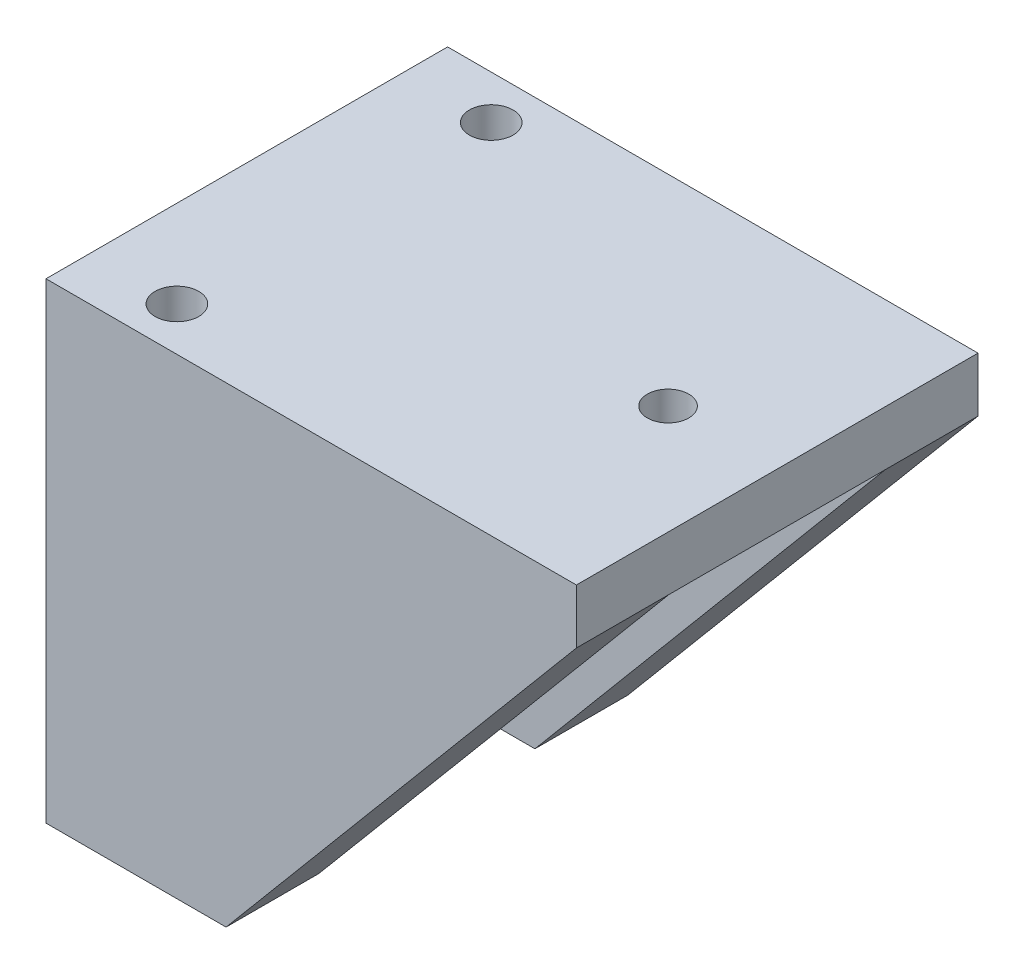
ISO-10303-21;
HEADER;
FILE_DESCRIPTION(('STEP AP214'),'2;1');
FILE_NAME('part.step','',(''),(''),'','','');
FILE_SCHEMA(('AUTOMOTIVE_DESIGN { 1 0 10303 214 1 1 1 1 }'));
ENDSEC;
DATA;
#1=APPLICATION_CONTEXT('core data for automotive mechanical design processes');
#2=APPLICATION_PROTOCOL_DEFINITION('international standard','automotive_design',2000,#1);
#3=PRODUCT_CONTEXT('',#1,'mechanical');
#4=PRODUCT('Part','Part','',(#3));
#5=PRODUCT_RELATED_PRODUCT_CATEGORY('part','',(#4));
#6=PRODUCT_DEFINITION_FORMATION('','',#4);
#7=PRODUCT_DEFINITION_CONTEXT('part definition',#1,'design');
#8=PRODUCT_DEFINITION('design','',#6,#7);
#9=PRODUCT_DEFINITION_SHAPE('','',#8);
#10=(LENGTH_UNIT() NAMED_UNIT(*) SI_UNIT(.MILLI.,.METRE.));
#11=(NAMED_UNIT(*) PLANE_ANGLE_UNIT() SI_UNIT($,.RADIAN.));
#12=(NAMED_UNIT(*) SI_UNIT($,.STERADIAN.) SOLID_ANGLE_UNIT());
#13=UNCERTAINTY_MEASURE_WITH_UNIT(LENGTH_MEASURE(1.E-05),#10,'distance_accuracy_value','');
#14=(GEOMETRIC_REPRESENTATION_CONTEXT(3) GLOBAL_UNCERTAINTY_ASSIGNED_CONTEXT((#13)) GLOBAL_UNIT_ASSIGNED_CONTEXT((#10,
#11,#12)) REPRESENTATION_CONTEXT('',''));
#15=CARTESIAN_POINT('',(0.,0.,0.));
#16=DIRECTION('',(0.,0.,1.));
#17=DIRECTION('',(1.,0.,0.));
#18=AXIS2_PLACEMENT_3D('',#15,#16,#17);
#19=CARTESIAN_POINT('',(-48.6730965518551,-8.5,28.3));
#20=DIRECTION('',(0.,1.,0.));
#21=DIRECTION('',(0.,0.,1.));
#22=AXIS2_PLACEMENT_3D('',#19,#20,#21);
#23=PLANE('',#22);
#24=CARTESIAN_POINT('',(-40.6730965518551,-8.5,-4.49576462355147));
#25=DIRECTION('',(0.,-1.,0.));
#26=DIRECTION('',(0.,0.,-1.));
#27=AXIS2_PLACEMENT_3D('',#24,#25,#26);
#28=CIRCLE('',#27,2.);
#29=CARTESIAN_POINT('',(-40.6730965518551,-8.5,-6.49576462355148));
#30=VERTEX_POINT('',#29);
#31=EDGE_CURVE('E253',#30,#30,#28,.T.);
#32=ORIENTED_EDGE('',*,*,#31,.F.);
#33=EDGE_LOOP('',(#32));
#34=FACE_BOUND('',#33,.T.);
#35=DIRECTION('',(-1.,0.,0.));
#36=VECTOR('',#35,1.);
#37=CARTESIAN_POINT('',(-32.1730965518551,-8.5,0.));
#38=LINE('',#37,#36);
#39=CARTESIAN_POINT('',(-32.1730965518551,-8.5,0.));
#40=VERTEX_POINT('',#39);
#41=CARTESIAN_POINT('',(-48.6730965518551,-8.5,0.));
#42=VERTEX_POINT('',#41);
#43=EDGE_CURVE('E123',#40,#42,#38,.T.);
#44=ORIENTED_EDGE('',*,*,#43,.T.);
#45=DIRECTION('',(0.,0.,-1.));
#46=VECTOR('',#45,1.);
#47=CARTESIAN_POINT('',(-48.6730965518551,-8.5,28.3));
#48=LINE('',#47,#46);
#49=CARTESIAN_POINT('',(-48.6730965518551,-8.5,-8.5));
#50=VERTEX_POINT('',#49);
#51=EDGE_CURVE('E133',#42,#50,#48,.T.);
#52=ORIENTED_EDGE('',*,*,#51,.T.);
#53=DIRECTION('',(-1.,0.,0.));
#54=VECTOR('',#53,1.);
#55=CARTESIAN_POINT('',(-32.1730965518551,-8.5,-8.5));
#56=LINE('',#55,#54);
#57=CARTESIAN_POINT('',(-32.1730965518551,-8.5,-8.5));
#58=VERTEX_POINT('',#57);
#59=EDGE_CURVE('E223',#58,#50,#56,.T.);
#60=ORIENTED_EDGE('',*,*,#59,.F.);
#61=DIRECTION('',(0.,0.,1.));
#62=VECTOR('',#61,1.);
#63=CARTESIAN_POINT('',(-32.1730965518551,-8.5,-8.5));
#64=LINE('',#63,#62);
#65=EDGE_CURVE('E136',#58,#40,#64,.T.);
#66=ORIENTED_EDGE('',*,*,#65,.T.);
#67=EDGE_LOOP('',(#44,#52,#60,#66));
#68=FACE_BOUND('',#67,.T.);
#69=ADVANCED_FACE('F33',(#34,#68),#23,.F.);
#70=CARTESIAN_POINT('',(0.,0.,19.8));
#71=DIRECTION('',(0.,0.,1.));
#72=DIRECTION('',(1.,0.,0.));
#73=AXIS2_PLACEMENT_3D('',#70,#71,#72);
#74=PLANE('',#73);
#75=DIRECTION('',(1.,0.,0.));
#76=VECTOR('',#75,1.);
#77=CARTESIAN_POINT('',(-48.6730965518551,-8.5,19.8));
#78=LINE('',#77,#76);
#79=CARTESIAN_POINT('',(-48.6730965518551,-8.5,19.8));
#80=VERTEX_POINT('',#79);
#81=CARTESIAN_POINT('',(-32.1730965518551,-8.5,19.8));
#82=VERTEX_POINT('',#81);
#83=EDGE_CURVE('E191',#80,#82,#78,.T.);
#84=ORIENTED_EDGE('',*,*,#83,.F.);
#85=DIRECTION('',(0.,-1.,0.));
#86=VECTOR('',#85,1.);
#87=CARTESIAN_POINT('',(-48.6730965518551,34.7,19.8));
#88=LINE('',#87,#86);
#89=CARTESIAN_POINT('',(-48.6730965518551,2.79999999999999,19.8));
#90=VERTEX_POINT('',#89);
#91=EDGE_CURVE('E189',#90,#80,#88,.T.);
#92=ORIENTED_EDGE('',*,*,#91,.F.);
#93=DIRECTION('',(1.,0.,0.));
#94=VECTOR('',#93,1.);
#95=CARTESIAN_POINT('',(-48.6730965518551,2.79999999999999,19.8));
#96=LINE('',#95,#94);
#97=CARTESIAN_POINT('',(-40.6730965518551,2.79999999999999,19.8));
#98=VERTEX_POINT('',#97);
#99=EDGE_CURVE('E151',#90,#98,#96,.T.);
#100=ORIENTED_EDGE('',*,*,#99,.T.);
#101=DIRECTION('',(0.,1.,0.));
#102=VECTOR('',#101,1.);
#103=CARTESIAN_POINT('',(-40.6730965518551,29.7,19.8));
#104=LINE('',#103,#102);
#105=CARTESIAN_POINT('',(-40.6730965518551,29.7,19.8));
#106=VERTEX_POINT('',#105);
#107=EDGE_CURVE('E154',#98,#106,#104,.T.);
#108=ORIENTED_EDGE('',*,*,#107,.T.);
#109=DIRECTION('',(1.,0.,0.));
#110=VECTOR('',#109,1.);
#111=CARTESIAN_POINT('',(-40.6730965518551,29.7,19.8));
#112=LINE('',#111,#110);
#113=CARTESIAN_POINT('',(-0.0730965518550564,29.7,19.8));
#114=VERTEX_POINT('',#113);
#115=EDGE_CURVE('E158',#106,#114,#112,.T.);
#116=ORIENTED_EDGE('',*,*,#115,.T.);
#117=DIRECTION('',(0.6433330806464,0.765586407498208,0.));
#118=VECTOR('',#117,1.);
#119=CARTESIAN_POINT('',(-0.0730965518550564,29.7,19.8));
#120=LINE('',#119,#118);
#121=EDGE_CURVE('E195',#82,#114,#120,.T.);
#122=ORIENTED_EDGE('',*,*,#121,.F.);
#123=EDGE_LOOP('',(#84,#92,#100,#108,#116,#122));
#124=FACE_BOUND('',#123,.T.);
#125=ADVANCED_FACE('F187',(#124),#74,.F.);
#126=CARTESIAN_POINT('',(-48.6730965518551,2.79999999999999,19.8));
#127=DIRECTION('',(1.,0.,0.));
#128=DIRECTION('',(0.,0.,-1.));
#129=AXIS2_PLACEMENT_3D('',#126,#127,#128);
#130=PLANE('',#129);
#131=ORIENTED_EDGE('',*,*,#51,.F.);
#132=DIRECTION('',(0.,1.,0.));
#133=VECTOR('',#132,1.);
#134=CARTESIAN_POINT('',(-48.6730965518551,-8.5,0.));
#135=LINE('',#134,#133);
#136=CARTESIAN_POINT('',(-48.6730965518551,2.79999999999999,0.));
#137=VERTEX_POINT('',#136);
#138=EDGE_CURVE('E119',#42,#137,#135,.T.);
#139=ORIENTED_EDGE('',*,*,#138,.T.);
#140=DIRECTION('',(0.,0.,-1.));
#141=VECTOR('',#140,1.);
#142=CARTESIAN_POINT('',(-48.6730965518551,2.79999999999999,19.8));
#143=LINE('',#142,#141);
#144=EDGE_CURVE('E173',#90,#137,#143,.T.);
#145=ORIENTED_EDGE('',*,*,#144,.F.);
#146=ORIENTED_EDGE('',*,*,#91,.T.);
#147=CARTESIAN_POINT('',(-48.6730965518551,-8.5,28.3));
#148=VERTEX_POINT('',#147);
#149=EDGE_CURVE('E142',#148,#80,#48,.T.);
#150=ORIENTED_EDGE('',*,*,#149,.F.);
#151=DIRECTION('',(0.,-1.,0.));
#152=VECTOR('',#151,1.);
#153=CARTESIAN_POINT('',(-48.6730965518551,34.7,28.3));
#154=LINE('',#153,#152);
#155=CARTESIAN_POINT('',(-48.6730965518551,34.7,28.3));
#156=VERTEX_POINT('',#155);
#157=EDGE_CURVE('E203',#156,#148,#154,.T.);
#158=ORIENTED_EDGE('',*,*,#157,.F.);
#159=DIRECTION('',(0.,0.,-1.));
#160=VECTOR('',#159,1.);
#161=CARTESIAN_POINT('',(-48.6730965518551,34.7,19.8));
#162=LINE('',#161,#160);
#163=CARTESIAN_POINT('',(-48.6730965518551,34.7,-8.5));
#164=VERTEX_POINT('',#163);
#165=EDGE_CURVE('E175',#156,#164,#162,.T.);
#166=ORIENTED_EDGE('',*,*,#165,.T.);
#167=DIRECTION('',(0.,1.,0.));
#168=VECTOR('',#167,1.);
#169=CARTESIAN_POINT('',(-48.6730965518551,-8.5,-8.5));
#170=LINE('',#169,#168);
#171=EDGE_CURVE('E140',#50,#164,#170,.T.);
#172=ORIENTED_EDGE('',*,*,#171,.F.);
#173=EDGE_LOOP('',(#131,#139,#145,#146,#150,#158,#166,#172));
#174=FACE_BOUND('',#173,.T.);
#175=ADVANCED_FACE('F35',(#174),#130,.F.);
#176=CARTESIAN_POINT('',(-48.6730965518551,2.79999999999999,19.8));
#177=DIRECTION('',(0.,1.,0.));
#178=DIRECTION('',(0.,0.,1.));
#179=AXIS2_PLACEMENT_3D('',#176,#177,#178);
#180=PLANE('',#179);
#181=CARTESIAN_POINT('',(-45.2730965518551,2.79999999999999,4.9));
#182=DIRECTION('',(0.,1.,0.));
#183=DIRECTION('',(0.,0.,1.));
#184=AXIS2_PLACEMENT_3D('',#181,#182,#183);
#185=CIRCLE('',#184,1.65);
#186=CARTESIAN_POINT('',(-45.2730965518551,2.79999999999999,6.55));
#187=VERTEX_POINT('',#186);
#188=EDGE_CURVE('E11',#187,#187,#185,.F.);
#189=ORIENTED_EDGE('',*,*,#188,.F.);
#190=EDGE_LOOP('',(#189));
#191=FACE_BOUND('',#190,.T.);
#192=CARTESIAN_POINT('',(-45.2730965518551,2.79999999999999,14.9));
#193=DIRECTION('',(0.,1.,0.));
#194=DIRECTION('',(0.,0.,1.));
#195=AXIS2_PLACEMENT_3D('',#192,#193,#194);
#196=CIRCLE('',#195,1.64999999999999);
#197=CARTESIAN_POINT('',(-45.2730965518551,2.79999999999999,16.55));
#198=VERTEX_POINT('',#197);
#199=EDGE_CURVE('E41',#198,#198,#196,.F.);
#200=ORIENTED_EDGE('',*,*,#199,.F.);
#201=EDGE_LOOP('',(#200));
#202=FACE_BOUND('',#201,.T.);
#203=DIRECTION('',(1.,0.,0.));
#204=VECTOR('',#203,1.);
#205=CARTESIAN_POINT('',(-48.6730965518551,2.79999999999999,0.));
#206=LINE('',#205,#204);
#207=CARTESIAN_POINT('',(-40.6730965518551,2.79999999999999,0.));
#208=VERTEX_POINT('',#207);
#209=EDGE_CURVE('E124',#137,#208,#206,.T.);
#210=ORIENTED_EDGE('',*,*,#209,.T.);
#211=DIRECTION('',(0.,0.,-1.));
#212=VECTOR('',#211,1.);
#213=CARTESIAN_POINT('',(-40.6730965518551,2.79999999999999,19.8));
#214=LINE('',#213,#212);
#215=EDGE_CURVE('E56',#98,#208,#214,.T.);
#216=ORIENTED_EDGE('',*,*,#215,.F.);
#217=ORIENTED_EDGE('',*,*,#99,.F.);
#218=ORIENTED_EDGE('',*,*,#144,.T.);
#219=EDGE_LOOP('',(#210,#216,#217,#218));
#220=FACE_BOUND('',#219,.T.);
#221=ADVANCED_FACE('F181',(#191,#202,#220),#180,.F.);
#222=CARTESIAN_POINT('',(-40.6730965518551,29.7,19.8));
#223=DIRECTION('',(-1.,0.,0.));
#224=DIRECTION('',(0.,0.,1.));
#225=AXIS2_PLACEMENT_3D('',#222,#223,#224);
#226=PLANE('',#225);
#227=DIRECTION('',(0.,1.,0.));
#228=VECTOR('',#227,1.);
#229=CARTESIAN_POINT('',(-40.6730965518551,29.7,0.));
#230=LINE('',#229,#228);
#231=CARTESIAN_POINT('',(-40.6730965518551,29.7,0.));
#232=VERTEX_POINT('',#231);
#233=EDGE_CURVE('E163',#208,#232,#230,.T.);
#234=ORIENTED_EDGE('',*,*,#233,.T.);
#235=DIRECTION('',(0.,0.,-1.));
#236=VECTOR('',#235,1.);
#237=CARTESIAN_POINT('',(-40.6730965518551,29.7,19.8));
#238=LINE('',#237,#236);
#239=EDGE_CURVE('E48',#106,#232,#238,.T.);
#240=ORIENTED_EDGE('',*,*,#239,.F.);
#241=ORIENTED_EDGE('',*,*,#107,.F.);
#242=ORIENTED_EDGE('',*,*,#215,.T.);
#243=EDGE_LOOP('',(#234,#240,#241,#242));
#244=FACE_BOUND('',#243,.T.);
#245=ADVANCED_FACE('F183',(#244),#226,.F.);
#246=CARTESIAN_POINT('',(-40.6730965518551,29.7,19.8));
#247=DIRECTION('',(0.,1.,0.));
#248=DIRECTION('',(0.,0.,1.));
#249=AXIS2_PLACEMENT_3D('',#246,#247,#248);
#250=PLANE('',#249);
#251=CARTESIAN_POINT('',(-10.0730965518551,29.7,9.9));
#252=DIRECTION('',(0.,1.,0.));
#253=DIRECTION('',(0.,0.,1.));
#254=AXIS2_PLACEMENT_3D('',#251,#252,#253);
#255=CIRCLE('',#254,1.9);
#256=CARTESIAN_POINT('',(-10.0730965518551,29.7,11.8));
#257=VERTEX_POINT('',#256);
#258=EDGE_CURVE('E137',#257,#257,#255,.F.);
#259=ORIENTED_EDGE('',*,*,#258,.F.);
#260=EDGE_LOOP('',(#259));
#261=FACE_BOUND('',#260,.T.);
#262=DIRECTION('',(1.,0.,0.));
#263=VECTOR('',#262,1.);
#264=CARTESIAN_POINT('',(-40.6730965518551,29.7,0.));
#265=LINE('',#264,#263);
#266=CARTESIAN_POINT('',(-0.0730965518550564,29.7,0.));
#267=VERTEX_POINT('',#266);
#268=EDGE_CURVE('E155',#232,#267,#265,.T.);
#269=ORIENTED_EDGE('',*,*,#268,.T.);
#270=DIRECTION('',(0.,0.,-1.));
#271=VECTOR('',#270,1.);
#272=CARTESIAN_POINT('',(-0.0730965518550564,29.7,19.8));
#273=LINE('',#272,#271);
#274=EDGE_CURVE('E168',#114,#267,#273,.T.);
#275=ORIENTED_EDGE('',*,*,#274,.F.);
#276=ORIENTED_EDGE('',*,*,#115,.F.);
#277=ORIENTED_EDGE('',*,*,#239,.T.);
#278=EDGE_LOOP('',(#269,#275,#276,#277));
#279=FACE_BOUND('',#278,.T.);
#280=ADVANCED_FACE('F295',(#261,#279),#250,.F.);
#281=CARTESIAN_POINT('',(-0.0730965518550564,34.7,19.8));
#282=DIRECTION('',(-1.,0.,0.));
#283=DIRECTION('',(0.,0.,1.));
#284=AXIS2_PLACEMENT_3D('',#281,#282,#283);
#285=PLANE('',#284);
#286=ORIENTED_EDGE('',*,*,#274,.T.);
#287=DIRECTION('',(0.,0.,1.));
#288=VECTOR('',#287,1.);
#289=CARTESIAN_POINT('',(-0.0730965518550564,29.7,-8.5));
#290=LINE('',#289,#288);
#291=CARTESIAN_POINT('',(-0.0730965518550564,29.7,-8.5));
#292=VERTEX_POINT('',#291);
#293=EDGE_CURVE('E193',#292,#267,#290,.T.);
#294=ORIENTED_EDGE('',*,*,#293,.F.);
#295=DIRECTION('',(0.,-1.,0.));
#296=VECTOR('',#295,1.);
#297=CARTESIAN_POINT('',(-0.0730965518550564,34.7,-8.5));
#298=LINE('',#297,#296);
#299=CARTESIAN_POINT('',(-0.0730965518550564,34.7,-8.5));
#300=VERTEX_POINT('',#299);
#301=EDGE_CURVE('E226',#300,#292,#298,.T.);
#302=ORIENTED_EDGE('',*,*,#301,.F.);
#303=DIRECTION('',(0.,0.,-1.));
#304=VECTOR('',#303,1.);
#305=CARTESIAN_POINT('',(-0.0730965518550564,34.7,19.8));
#306=LINE('',#305,#304);
#307=CARTESIAN_POINT('',(-0.0730965518550564,34.7,28.3));
#308=VERTEX_POINT('',#307);
#309=EDGE_CURVE('E161',#308,#300,#306,.T.);
#310=ORIENTED_EDGE('',*,*,#309,.F.);
#311=DIRECTION('',(0.,1.,0.));
#312=VECTOR('',#311,1.);
#313=CARTESIAN_POINT('',(-0.0730965518550564,34.7,28.3));
#314=LINE('',#313,#312);
#315=CARTESIAN_POINT('',(-0.0730965518550564,29.7,28.3));
#316=VERTEX_POINT('',#315);
#317=EDGE_CURVE('E209',#316,#308,#314,.T.);
#318=ORIENTED_EDGE('',*,*,#317,.F.);
#319=DIRECTION('',(0.,0.,-1.));
#320=VECTOR('',#319,1.);
#321=CARTESIAN_POINT('',(-0.0730965518550564,29.7,28.3));
#322=LINE('',#321,#320);
#323=EDGE_CURVE('E147',#316,#114,#322,.T.);
#324=ORIENTED_EDGE('',*,*,#323,.T.);
#325=EDGE_LOOP('',(#286,#294,#302,#310,#318,#324));
#326=FACE_BOUND('',#325,.T.);
#327=ADVANCED_FACE('F279',(#326),#285,.F.);
#328=CARTESIAN_POINT('',(-41.6730965518551,34.7,19.8));
#329=DIRECTION('',(0.,-1.,0.));
#330=DIRECTION('',(0.,0.,-1.));
#331=AXIS2_PLACEMENT_3D('',#328,#329,#330);
#332=PLANE('',#331);
#333=CARTESIAN_POINT('',(-40.6730965518551,34.7,-4.49576462355147));
#334=DIRECTION('',(0.,-1.,0.));
#335=DIRECTION('',(0.,0.,-1.));
#336=AXIS2_PLACEMENT_3D('',#333,#334,#335);
#337=CIRCLE('',#336,2.);
#338=CARTESIAN_POINT('',(-40.6730965518551,34.7,-6.49576462355148));
#339=VERTEX_POINT('',#338);
#340=EDGE_CURVE('E250',#339,#339,#337,.F.);
#341=ORIENTED_EDGE('',*,*,#340,.F.);
#342=EDGE_LOOP('',(#341));
#343=FACE_BOUND('',#342,.T.);
#344=CARTESIAN_POINT('',(-40.6770037559953,34.7,24.3));
#345=DIRECTION('',(0.,-1.,0.));
#346=DIRECTION('',(0.,0.,-1.));
#347=AXIS2_PLACEMENT_3D('',#344,#345,#346);
#348=CIRCLE('',#347,2.);
#349=CARTESIAN_POINT('',(-40.6770037559953,34.7,22.3));
#350=VERTEX_POINT('',#349);
#351=EDGE_CURVE('E244',#350,#350,#348,.F.);
#352=ORIENTED_EDGE('',*,*,#351,.F.);
#353=EDGE_LOOP('',(#352));
#354=FACE_BOUND('',#353,.T.);
#355=CARTESIAN_POINT('',(-10.0730965518551,34.7,9.9));
#356=DIRECTION('',(0.,1.,0.));
#357=DIRECTION('',(0.,0.,1.));
#358=AXIS2_PLACEMENT_3D('',#355,#356,#357);
#359=CIRCLE('',#358,1.9);
#360=CARTESIAN_POINT('',(-10.0730965518551,34.7,11.8));
#361=VERTEX_POINT('',#360);
#362=EDGE_CURVE('E235',#361,#361,#359,.T.);
#363=ORIENTED_EDGE('',*,*,#362,.F.);
#364=EDGE_LOOP('',(#363));
#365=FACE_BOUND('',#364,.T.);
#366=ORIENTED_EDGE('',*,*,#309,.T.);
#367=DIRECTION('',(1.,0.,0.));
#368=VECTOR('',#367,1.);
#369=CARTESIAN_POINT('',(-48.6730965518551,34.7,-8.5));
#370=LINE('',#369,#368);
#371=EDGE_CURVE('E228',#164,#300,#370,.T.);
#372=ORIENTED_EDGE('',*,*,#371,.F.);
#373=ORIENTED_EDGE('',*,*,#165,.F.);
#374=DIRECTION('',(-1.,0.,0.));
#375=VECTOR('',#374,1.);
#376=CARTESIAN_POINT('',(-0.0730965518550564,34.7,28.3));
#377=LINE('',#376,#375);
#378=EDGE_CURVE('E199',#308,#156,#377,.T.);
#379=ORIENTED_EDGE('',*,*,#378,.F.);
#380=EDGE_LOOP('',(#366,#372,#373,#379));
#381=FACE_BOUND('',#380,.T.);
#382=ADVANCED_FACE('F271',(#343,#354,#365,#381),#332,.F.);
#383=CARTESIAN_POINT('',(-40.6770037559953,-8.5,24.3));
#384=DIRECTION('',(0.,-1.,0.));
#385=DIRECTION('',(0.,0.,-1.));
#386=AXIS2_PLACEMENT_3D('',#383,#384,#385);
#387=CIRCLE('',#386,2.);
#388=CARTESIAN_POINT('',(-40.6770037559953,-8.5,22.3));
#389=VERTEX_POINT('',#388);
#390=EDGE_CURVE('E247',#389,#389,#387,.T.);
#391=ORIENTED_EDGE('',*,*,#390,.F.);
#392=EDGE_LOOP('',(#391));
#393=FACE_BOUND('',#392,.T.);
#394=ORIENTED_EDGE('',*,*,#149,.T.);
#395=ORIENTED_EDGE('',*,*,#83,.T.);
#396=DIRECTION('',(0.,0.,-1.));
#397=VECTOR('',#396,1.);
#398=CARTESIAN_POINT('',(-32.1730965518551,-8.5,28.3));
#399=LINE('',#398,#397);
#400=CARTESIAN_POINT('',(-32.1730965518551,-8.5,28.3));
#401=VERTEX_POINT('',#400);
#402=EDGE_CURVE('E143',#401,#82,#399,.T.);
#403=ORIENTED_EDGE('',*,*,#402,.F.);
#404=DIRECTION('',(1.,0.,0.));
#405=VECTOR('',#404,1.);
#406=CARTESIAN_POINT('',(-48.6730965518551,-8.5,28.3));
#407=LINE('',#406,#405);
#408=EDGE_CURVE('E216',#148,#401,#407,.T.);
#409=ORIENTED_EDGE('',*,*,#408,.F.);
#410=EDGE_LOOP('',(#394,#395,#403,#409));
#411=FACE_BOUND('',#410,.T.);
#412=ADVANCED_FACE('F262',(#393,#411),#23,.F.);
#413=CARTESIAN_POINT('',(-0.0730965518550564,29.7,28.3));
#414=DIRECTION('',(-0.765586407498208,0.6433330806464,0.));
#415=DIRECTION('',(-0.6433330806464,-0.765586407498208,0.));
#416=AXIS2_PLACEMENT_3D('',#413,#414,#415);
#417=PLANE('',#416);
#418=ORIENTED_EDGE('',*,*,#121,.T.);
#419=ORIENTED_EDGE('',*,*,#323,.F.);
#420=DIRECTION('',(0.6433330806464,0.765586407498208,0.));
#421=VECTOR('',#420,1.);
#422=CARTESIAN_POINT('',(-0.0730965518550564,29.7,28.3));
#423=LINE('',#422,#421);
#424=EDGE_CURVE('E215',#401,#316,#423,.T.);
#425=ORIENTED_EDGE('',*,*,#424,.F.);
#426=ORIENTED_EDGE('',*,*,#402,.T.);
#427=EDGE_LOOP('',(#418,#419,#425,#426));
#428=FACE_BOUND('',#427,.T.);
#429=ADVANCED_FACE('F270',(#428),#417,.F.);
#430=CARTESIAN_POINT('',(0.,0.,28.3));
#431=DIRECTION('',(0.,0.,1.));
#432=DIRECTION('',(1.,0.,0.));
#433=AXIS2_PLACEMENT_3D('',#430,#431,#432);
#434=PLANE('',#433);
#435=ORIENTED_EDGE('',*,*,#157,.T.);
#436=ORIENTED_EDGE('',*,*,#408,.T.);
#437=ORIENTED_EDGE('',*,*,#424,.T.);
#438=ORIENTED_EDGE('',*,*,#317,.T.);
#439=ORIENTED_EDGE('',*,*,#378,.T.);
#440=EDGE_LOOP('',(#435,#436,#437,#438,#439));
#441=FACE_BOUND('',#440,.T.);
#442=ADVANCED_FACE('F277',(#441),#434,.T.);
#443=CARTESIAN_POINT('',(0.,0.,0.));
#444=DIRECTION('',(0.,0.,-1.));
#445=DIRECTION('',(-1.,0.,0.));
#446=AXIS2_PLACEMENT_3D('',#443,#444,#445);
#447=PLANE('',#446);
#448=ORIENTED_EDGE('',*,*,#138,.F.);
#449=ORIENTED_EDGE('',*,*,#43,.F.);
#450=DIRECTION('',(-0.6433330806464,-0.765586407498208,0.));
#451=VECTOR('',#450,1.);
#452=CARTESIAN_POINT('',(-0.0730965518550564,29.7,0.));
#453=LINE('',#452,#451);
#454=EDGE_CURVE('E128',#267,#40,#453,.T.);
#455=ORIENTED_EDGE('',*,*,#454,.F.);
#456=ORIENTED_EDGE('',*,*,#268,.F.);
#457=ORIENTED_EDGE('',*,*,#233,.F.);
#458=ORIENTED_EDGE('',*,*,#209,.F.);
#459=EDGE_LOOP('',(#448,#449,#455,#456,#457,#458));
#460=FACE_BOUND('',#459,.T.);
#461=ADVANCED_FACE('F121',(#460),#447,.F.);
#462=CARTESIAN_POINT('',(-0.0730965518550564,29.7,-8.5));
#463=DIRECTION('',(-0.765586407498208,0.6433330806464,0.));
#464=DIRECTION('',(-0.6433330806464,-0.765586407498208,0.));
#465=AXIS2_PLACEMENT_3D('',#462,#463,#464);
#466=PLANE('',#465);
#467=ORIENTED_EDGE('',*,*,#454,.T.);
#468=ORIENTED_EDGE('',*,*,#65,.F.);
#469=DIRECTION('',(-0.6433330806464,-0.765586407498208,0.));
#470=VECTOR('',#469,1.);
#471=CARTESIAN_POINT('',(-0.0730965518550564,29.7,-8.5));
#472=LINE('',#471,#470);
#473=EDGE_CURVE('E222',#292,#58,#472,.T.);
#474=ORIENTED_EDGE('',*,*,#473,.F.);
#475=ORIENTED_EDGE('',*,*,#293,.T.);
#476=EDGE_LOOP('',(#467,#468,#474,#475));
#477=FACE_BOUND('',#476,.T.);
#478=ADVANCED_FACE('F293',(#477),#466,.F.);
#479=CARTESIAN_POINT('',(0.,0.,-8.5));
#480=DIRECTION('',(0.,0.,-1.));
#481=DIRECTION('',(-1.,0.,0.));
#482=AXIS2_PLACEMENT_3D('',#479,#480,#481);
#483=PLANE('',#482);
#484=ORIENTED_EDGE('',*,*,#59,.T.);
#485=ORIENTED_EDGE('',*,*,#171,.T.);
#486=ORIENTED_EDGE('',*,*,#371,.T.);
#487=ORIENTED_EDGE('',*,*,#301,.T.);
#488=ORIENTED_EDGE('',*,*,#473,.T.);
#489=EDGE_LOOP('',(#484,#485,#486,#487,#488));
#490=FACE_BOUND('',#489,.T.);
#491=ADVANCED_FACE('F290',(#490),#483,.T.);
#492=CARTESIAN_POINT('',(-10.0730965518551,-8.50100000000001,9.9));
#493=DIRECTION('',(0.,1.,0.));
#494=DIRECTION('',(0.,0.,1.));
#495=AXIS2_PLACEMENT_3D('',#492,#493,#494);
#496=CYLINDRICAL_SURFACE('',#495,1.9);
#497=ORIENTED_EDGE('',*,*,#362,.T.);
#498=EDGE_LOOP('',(#497));
#499=FACE_BOUND('',#498,.T.);
#500=ORIENTED_EDGE('',*,*,#258,.T.);
#501=EDGE_LOOP('',(#500));
#502=FACE_BOUND('',#501,.T.);
#503=ADVANCED_FACE('F307',(#499,#502),#496,.F.);
#504=CARTESIAN_POINT('',(-45.2730965518551,-13.1669047558312,14.9));
#505=DIRECTION('',(0.,1.,0.));
#506=DIRECTION('',(0.,0.,1.));
#507=AXIS2_PLACEMENT_3D('',#504,#505,#506);
#508=CYLINDRICAL_SURFACE('',#507,1.64999999999999);
#509=CARTESIAN_POINT('',(-45.2730965518551,-8.5,14.9));
#510=DIRECTION('',(0.,1.,0.));
#511=DIRECTION('',(0.,0.,1.));
#512=AXIS2_PLACEMENT_3D('',#509,#510,#511);
#513=CIRCLE('',#512,1.64999999999999);
#514=CARTESIAN_POINT('',(-45.2730965518551,-8.5,16.55));
#515=VERTEX_POINT('',#514);
#516=EDGE_CURVE('E238',#515,#515,#513,.T.);
#517=ORIENTED_EDGE('',*,*,#516,.T.);
#518=EDGE_LOOP('',(#517));
#519=FACE_BOUND('',#518,.T.);
#520=ORIENTED_EDGE('',*,*,#199,.T.);
#521=EDGE_LOOP('',(#520));
#522=FACE_BOUND('',#521,.T.);
#523=ADVANCED_FACE('F179',(#519,#522),#508,.T.);
#524=CARTESIAN_POINT('',(-48.6730965518551,-8.5,28.3));
#525=DIRECTION('',(0.,1.,0.));
#526=DIRECTION('',(0.,0.,1.));
#527=AXIS2_PLACEMENT_3D('',#524,#525,#526);
#528=PLANE('',#527);
#529=ORIENTED_EDGE('',*,*,#516,.F.);
#530=EDGE_LOOP('',(#529));
#531=FACE_BOUND('',#530,.T.);
#532=ADVANCED_FACE('F315',(#531),#528,.F.);
#533=CARTESIAN_POINT('',(-45.2730965518551,-13.1669047558312,4.9));
#534=DIRECTION('',(0.,1.,0.));
#535=DIRECTION('',(0.,0.,1.));
#536=AXIS2_PLACEMENT_3D('',#533,#534,#535);
#537=CYLINDRICAL_SURFACE('',#536,1.65);
#538=CARTESIAN_POINT('',(-45.2730965518551,-8.5,4.9));
#539=DIRECTION('',(0.,1.,0.));
#540=DIRECTION('',(0.,0.,1.));
#541=AXIS2_PLACEMENT_3D('',#538,#539,#540);
#542=CIRCLE('',#541,1.65);
#543=CARTESIAN_POINT('',(-45.2730965518551,-8.5,6.55));
#544=VERTEX_POINT('',#543);
#545=EDGE_CURVE('E241',#544,#544,#542,.T.);
#546=ORIENTED_EDGE('',*,*,#545,.T.);
#547=EDGE_LOOP('',(#546));
#548=FACE_BOUND('',#547,.T.);
#549=ORIENTED_EDGE('',*,*,#188,.T.);
#550=EDGE_LOOP('',(#549));
#551=FACE_BOUND('',#550,.T.);
#552=ADVANCED_FACE('F428',(#548,#551),#537,.T.);
#553=CARTESIAN_POINT('',(-48.6730965518551,-8.5,28.3));
#554=DIRECTION('',(0.,1.,0.));
#555=DIRECTION('',(0.,0.,1.));
#556=AXIS2_PLACEMENT_3D('',#553,#554,#555);
#557=PLANE('',#556);
#558=ORIENTED_EDGE('',*,*,#545,.F.);
#559=EDGE_LOOP('',(#558));
#560=FACE_BOUND('',#559,.T.);
#561=ADVANCED_FACE('F411',(#560),#557,.F.);
#562=CARTESIAN_POINT('',(-40.6770037559953,34.701,24.3));
#563=DIRECTION('',(0.,-1.,0.));
#564=DIRECTION('',(0.,0.,-1.));
#565=AXIS2_PLACEMENT_3D('',#562,#563,#564);
#566=CYLINDRICAL_SURFACE('',#565,2.);
#567=ORIENTED_EDGE('',*,*,#390,.T.);
#568=EDGE_LOOP('',(#567));
#569=FACE_BOUND('',#568,.T.);
#570=ORIENTED_EDGE('',*,*,#351,.T.);
#571=EDGE_LOOP('',(#570));
#572=FACE_BOUND('',#571,.T.);
#573=ADVANCED_FACE('F406',(#569,#572),#566,.F.);
#574=CARTESIAN_POINT('',(-40.6730965518551,34.701,-4.49576462355147));
#575=DIRECTION('',(0.,-1.,0.));
#576=DIRECTION('',(0.,0.,-1.));
#577=AXIS2_PLACEMENT_3D('',#574,#575,#576);
#578=CYLINDRICAL_SURFACE('',#577,2.);
#579=ORIENTED_EDGE('',*,*,#31,.T.);
#580=EDGE_LOOP('',(#579));
#581=FACE_BOUND('',#580,.T.);
#582=ORIENTED_EDGE('',*,*,#340,.T.);
#583=EDGE_LOOP('',(#582));
#584=FACE_BOUND('',#583,.T.);
#585=ADVANCED_FACE('F257',(#581,#584),#578,.F.);
#586=CLOSED_SHELL('',(#69,#125,#175,#221,#245,#280,#327,#382,#412,#429,#442,#461,#478,#491,#503,
#523,#532,#552,#561,#573,#585));
#587=MANIFOLD_SOLID_BREP('B2',#586);
#588=ADVANCED_BREP_SHAPE_REPRESENTATION('',(#18,#587),#14);
#589=SHAPE_DEFINITION_REPRESENTATION(#9,#588);
ENDSEC;
END-ISO-10303-21;
